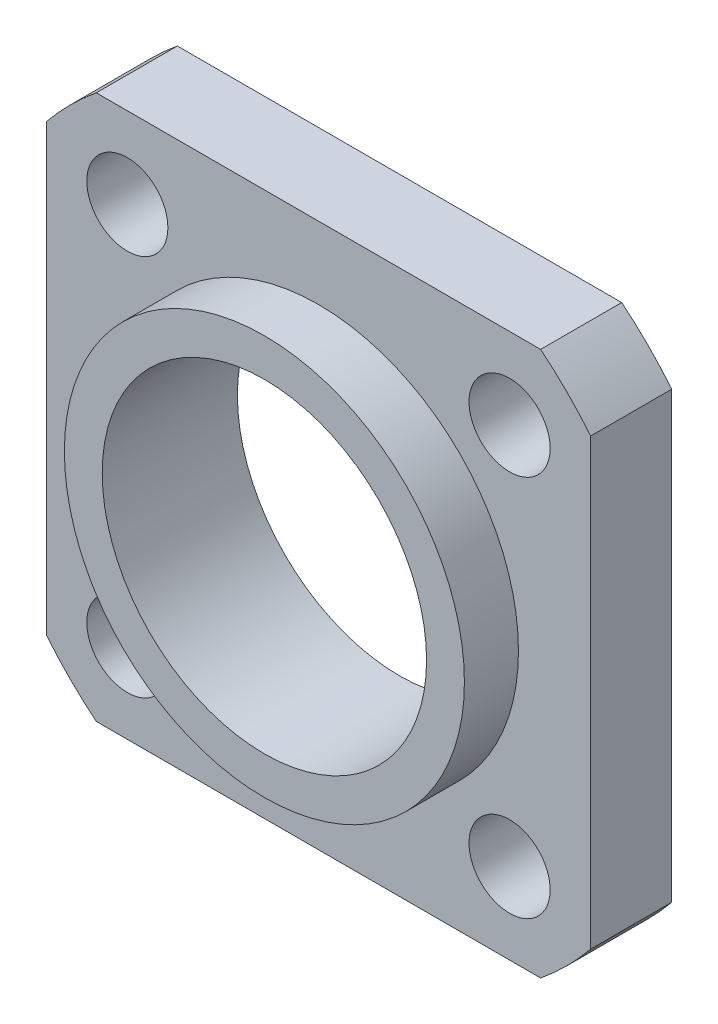
ISO-10303-21;
HEADER;
FILE_DESCRIPTION(('STEP AP214'),'2;1');
FILE_NAME('part.step','',(''),(''),'','','');
FILE_SCHEMA(('AUTOMOTIVE_DESIGN { 1 0 10303 214 1 1 1 1 }'));
ENDSEC;
DATA;
#1=APPLICATION_CONTEXT('core data for automotive mechanical design processes');
#2=APPLICATION_PROTOCOL_DEFINITION('international standard','automotive_design',2000,#1);
#3=PRODUCT_CONTEXT('',#1,'mechanical');
#4=PRODUCT('Part','Part','',(#3));
#5=PRODUCT_RELATED_PRODUCT_CATEGORY('part','',(#4));
#6=PRODUCT_DEFINITION_FORMATION('','',#4);
#7=PRODUCT_DEFINITION_CONTEXT('part definition',#1,'design');
#8=PRODUCT_DEFINITION('design','',#6,#7);
#9=PRODUCT_DEFINITION_SHAPE('','',#8);
#10=(LENGTH_UNIT() NAMED_UNIT(*) SI_UNIT(.MILLI.,.METRE.));
#11=(NAMED_UNIT(*) PLANE_ANGLE_UNIT() SI_UNIT($,.RADIAN.));
#12=(NAMED_UNIT(*) SI_UNIT($,.STERADIAN.) SOLID_ANGLE_UNIT());
#13=UNCERTAINTY_MEASURE_WITH_UNIT(LENGTH_MEASURE(1.E-05),#10,'distance_accuracy_value','');
#14=(GEOMETRIC_REPRESENTATION_CONTEXT(3) GLOBAL_UNCERTAINTY_ASSIGNED_CONTEXT((#13)) GLOBAL_UNIT_ASSIGNED_CONTEXT((#10,
#11,#12)) REPRESENTATION_CONTEXT('',''));
#15=CARTESIAN_POINT('',(0.,0.,0.));
#16=DIRECTION('',(0.,0.,1.));
#17=DIRECTION('',(1.,0.,0.));
#18=AXIS2_PLACEMENT_3D('',#15,#16,#17);
#19=CARTESIAN_POINT('',(0.,0.,3.));
#20=DIRECTION('',(0.,0.,-1.));
#21=DIRECTION('',(-1.,0.,0.));
#22=AXIS2_PLACEMENT_3D('',#19,#20,#21);
#23=CYLINDRICAL_SURFACE('',#22,13.);
#24=CARTESIAN_POINT('',(0.,0.,3.));
#25=DIRECTION('',(0.,0.,1.));
#26=DIRECTION('',(1.,0.,0.));
#27=AXIS2_PLACEMENT_3D('',#24,#25,#26);
#28=CIRCLE('',#27,13.);
#29=CARTESIAN_POINT('',(-8.22031587767818,10.0710678118654,3.));
#30=VERTEX_POINT('',#29);
#31=CARTESIAN_POINT('',(-10.0710678118654,8.22031587767818,3.));
#32=VERTEX_POINT('',#31);
#33=EDGE_CURVE('E119',#30,#32,#28,.T.);
#34=ORIENTED_EDGE('',*,*,#33,.F.);
#35=DIRECTION('',(0.,0.,-1.));
#36=VECTOR('',#35,1.);
#37=CARTESIAN_POINT('',(-8.22031587767818,10.0710678118654,3.));
#38=LINE('',#37,#36);
#39=CARTESIAN_POINT('',(-8.22031587767818,10.0710678118654,0.));
#40=VERTEX_POINT('',#39);
#41=EDGE_CURVE('E11',#30,#40,#38,.T.);
#42=ORIENTED_EDGE('',*,*,#41,.T.);
#43=CARTESIAN_POINT('',(0.,0.,0.));
#44=DIRECTION('',(0.,0.,1.));
#45=DIRECTION('',(1.,0.,0.));
#46=AXIS2_PLACEMENT_3D('',#43,#44,#45);
#47=CIRCLE('',#46,13.);
#48=CARTESIAN_POINT('',(-10.0710678118654,8.22031587767818,0.));
#49=VERTEX_POINT('',#48);
#50=EDGE_CURVE('E142',#40,#49,#47,.T.);
#51=ORIENTED_EDGE('',*,*,#50,.T.);
#52=DIRECTION('',(0.,0.,-1.));
#53=VECTOR('',#52,1.);
#54=CARTESIAN_POINT('',(-10.0710678118654,8.22031587767818,3.));
#55=LINE('',#54,#53);
#56=EDGE_CURVE('E126',#49,#32,#55,.F.);
#57=ORIENTED_EDGE('',*,*,#56,.T.);
#58=EDGE_LOOP('',(#34,#42,#51,#57));
#59=FACE_BOUND('',#58,.T.);
#60=ADVANCED_FACE('F39',(#59),#23,.T.);
#61=CARTESIAN_POINT('',(10.0710678118654,8.22031587767818,0.));
#62=VERTEX_POINT('',#61);
#63=CARTESIAN_POINT('',(8.22031587767818,10.0710678118654,0.));
#64=VERTEX_POINT('',#63);
#65=EDGE_CURVE('E138',#62,#64,#47,.T.);
#66=ORIENTED_EDGE('',*,*,#65,.T.);
#67=DIRECTION('',(0.,0.,-1.));
#68=VECTOR('',#67,1.);
#69=CARTESIAN_POINT('',(8.22031587767818,10.0710678118654,3.));
#70=LINE('',#69,#68);
#71=CARTESIAN_POINT('',(8.22031587767818,10.0710678118654,3.));
#72=VERTEX_POINT('',#71);
#73=EDGE_CURVE('E48',#64,#72,#70,.F.);
#74=ORIENTED_EDGE('',*,*,#73,.T.);
#75=CARTESIAN_POINT('',(10.0710678118654,8.22031587767818,3.));
#76=VERTEX_POINT('',#75);
#77=EDGE_CURVE('E121',#76,#72,#28,.T.);
#78=ORIENTED_EDGE('',*,*,#77,.F.);
#79=DIRECTION('',(0.,0.,-1.));
#80=VECTOR('',#79,1.);
#81=CARTESIAN_POINT('',(10.0710678118654,8.22031587767818,3.));
#82=LINE('',#81,#80);
#83=EDGE_CURVE('E160',#76,#62,#82,.T.);
#84=ORIENTED_EDGE('',*,*,#83,.T.);
#85=EDGE_LOOP('',(#66,#74,#78,#84));
#86=FACE_BOUND('',#85,.T.);
#87=ADVANCED_FACE('F165',(#86),#23,.T.);
#88=CARTESIAN_POINT('',(8.22031587767818,-10.0710678118654,0.));
#89=VERTEX_POINT('',#88);
#90=CARTESIAN_POINT('',(10.0710678118654,-8.22031587767818,0.));
#91=VERTEX_POINT('',#90);
#92=EDGE_CURVE('E143',#89,#91,#47,.T.);
#93=ORIENTED_EDGE('',*,*,#92,.T.);
#94=DIRECTION('',(0.,0.,-1.));
#95=VECTOR('',#94,1.);
#96=CARTESIAN_POINT('',(10.0710678118654,-8.22031587767818,3.));
#97=LINE('',#96,#95);
#98=CARTESIAN_POINT('',(10.0710678118654,-8.22031587767818,3.));
#99=VERTEX_POINT('',#98);
#100=EDGE_CURVE('E157',#91,#99,#97,.F.);
#101=ORIENTED_EDGE('',*,*,#100,.T.);
#102=CARTESIAN_POINT('',(8.22031587767818,-10.0710678118654,3.));
#103=VERTEX_POINT('',#102);
#104=EDGE_CURVE('E132',#103,#99,#28,.T.);
#105=ORIENTED_EDGE('',*,*,#104,.F.);
#106=DIRECTION('',(0.,0.,-1.));
#107=VECTOR('',#106,1.);
#108=CARTESIAN_POINT('',(8.22031587767818,-10.0710678118654,3.));
#109=LINE('',#108,#107);
#110=EDGE_CURVE('E153',#103,#89,#109,.T.);
#111=ORIENTED_EDGE('',*,*,#110,.T.);
#112=EDGE_LOOP('',(#93,#101,#105,#111));
#113=FACE_BOUND('',#112,.T.);
#114=ADVANCED_FACE('F245',(#113),#23,.T.);
#115=CARTESIAN_POINT('',(0.,0.,3.));
#116=DIRECTION('',(0.,0.,1.));
#117=DIRECTION('',(1.,0.,0.));
#118=AXIS2_PLACEMENT_3D('',#115,#116,#117);
#119=PLANE('',#118);
#120=DIRECTION('',(1.,0.,0.));
#121=VECTOR('',#120,1.);
#122=CARTESIAN_POINT('',(-8.22031587767818,10.0710678118654,3.));
#123=LINE('',#122,#121);
#124=EDGE_CURVE('E105',#30,#72,#123,.T.);
#125=ORIENTED_EDGE('',*,*,#124,.F.);
#126=ORIENTED_EDGE('',*,*,#33,.T.);
#127=DIRECTION('',(0.,1.,0.));
#128=VECTOR('',#127,1.);
#129=CARTESIAN_POINT('',(-10.0710678118654,-8.22031587767818,3.));
#130=LINE('',#129,#128);
#131=CARTESIAN_POINT('',(-10.0710678118654,-8.22031587767818,3.));
#132=VERTEX_POINT('',#131);
#133=EDGE_CURVE('E398',#132,#32,#130,.T.);
#134=ORIENTED_EDGE('',*,*,#133,.F.);
#135=CARTESIAN_POINT('',(-8.22031587767818,-10.0710678118654,3.));
#136=VERTEX_POINT('',#135);
#137=EDGE_CURVE('E128',#132,#136,#28,.T.);
#138=ORIENTED_EDGE('',*,*,#137,.T.);
#139=DIRECTION('',(-1.,0.,0.));
#140=VECTOR('',#139,1.);
#141=CARTESIAN_POINT('',(8.22031587767818,-10.0710678118654,3.));
#142=LINE('',#141,#140);
#143=EDGE_CURVE('E63',#103,#136,#142,.T.);
#144=ORIENTED_EDGE('',*,*,#143,.F.);
#145=ORIENTED_EDGE('',*,*,#104,.T.);
#146=DIRECTION('',(0.,-1.,0.));
#147=VECTOR('',#146,1.);
#148=CARTESIAN_POINT('',(10.0710678118654,8.22031587767818,3.));
#149=LINE('',#148,#147);
#150=EDGE_CURVE('E55',#76,#99,#149,.T.);
#151=ORIENTED_EDGE('',*,*,#150,.F.);
#152=ORIENTED_EDGE('',*,*,#77,.T.);
#153=EDGE_LOOP('',(#125,#126,#134,#138,#144,#145,#151,#152));
#154=FACE_BOUND('',#153,.T.);
#155=CARTESIAN_POINT('',(-7.07106781186543,-7.07106781186552,3.));
#156=DIRECTION('',(0.,0.,1.));
#157=DIRECTION('',(1.,0.,0.));
#158=AXIS2_PLACEMENT_3D('',#155,#156,#157);
#159=CIRCLE('',#158,1.5);
#160=CARTESIAN_POINT('',(-5.57106781186543,-7.07106781186552,3.));
#161=VERTEX_POINT('',#160);
#162=EDGE_CURVE('E193',#161,#161,#159,.T.);
#163=ORIENTED_EDGE('',*,*,#162,.F.);
#164=EDGE_LOOP('',(#163));
#165=FACE_BOUND('',#164,.T.);
#166=CARTESIAN_POINT('',(7.07106781186543,7.07106781186551,3.));
#167=DIRECTION('',(0.,0.,1.));
#168=DIRECTION('',(1.,0.,0.));
#169=AXIS2_PLACEMENT_3D('',#166,#167,#168);
#170=CIRCLE('',#169,1.5);
#171=CARTESIAN_POINT('',(8.57106781186543,7.07106781186551,3.));
#172=VERTEX_POINT('',#171);
#173=EDGE_CURVE('E209',#172,#172,#170,.T.);
#174=ORIENTED_EDGE('',*,*,#173,.F.);
#175=EDGE_LOOP('',(#174));
#176=FACE_BOUND('',#175,.T.);
#177=CARTESIAN_POINT('',(-7.07106781186551,7.07106781186543,3.));
#178=DIRECTION('',(0.,0.,1.));
#179=DIRECTION('',(1.,0.,0.));
#180=AXIS2_PLACEMENT_3D('',#177,#178,#179);
#181=CIRCLE('',#180,1.5);
#182=CARTESIAN_POINT('',(-5.57106781186551,7.07106781186543,3.));
#183=VERTEX_POINT('',#182);
#184=EDGE_CURVE('E217',#183,#183,#181,.T.);
#185=ORIENTED_EDGE('',*,*,#184,.F.);
#186=EDGE_LOOP('',(#185));
#187=FACE_BOUND('',#186,.T.);
#188=CARTESIAN_POINT('',(7.07106781186552,-7.07106781186543,3.));
#189=DIRECTION('',(0.,0.,1.));
#190=DIRECTION('',(1.,0.,0.));
#191=AXIS2_PLACEMENT_3D('',#188,#189,#190);
#192=CIRCLE('',#191,1.5);
#193=CARTESIAN_POINT('',(8.57106781186551,-7.07106781186543,3.));
#194=VERTEX_POINT('',#193);
#195=EDGE_CURVE('E201',#194,#194,#192,.T.);
#196=ORIENTED_EDGE('',*,*,#195,.F.);
#197=EDGE_LOOP('',(#196));
#198=FACE_BOUND('',#197,.T.);
#199=CARTESIAN_POINT('',(0.,0.,3.));
#200=DIRECTION('',(0.,0.,1.));
#201=DIRECTION('',(1.,0.,0.));
#202=AXIS2_PLACEMENT_3D('',#199,#200,#201);
#203=CIRCLE('',#202,7.4);
#204=CARTESIAN_POINT('',(7.4,0.,3.));
#205=VERTEX_POINT('',#204);
#206=EDGE_CURVE('E179',#205,#205,#203,.T.);
#207=ORIENTED_EDGE('',*,*,#206,.F.);
#208=EDGE_LOOP('',(#207));
#209=FACE_BOUND('',#208,.T.);
#210=ADVANCED_FACE('F116',(#154,#165,#176,#187,#198,#209),#119,.T.);
#211=CARTESIAN_POINT('',(0.,0.,0.));
#212=DIRECTION('',(0.,0.,1.));
#213=DIRECTION('',(1.,0.,0.));
#214=AXIS2_PLACEMENT_3D('',#211,#212,#213);
#215=PLANE('',#214);
#216=ORIENTED_EDGE('',*,*,#50,.F.);
#217=DIRECTION('',(1.,0.,0.));
#218=VECTOR('',#217,1.);
#219=CARTESIAN_POINT('',(0.,10.0710678118654,0.));
#220=LINE('',#219,#218);
#221=EDGE_CURVE('E108',#40,#64,#220,.T.);
#222=ORIENTED_EDGE('',*,*,#221,.T.);
#223=ORIENTED_EDGE('',*,*,#65,.F.);
#224=DIRECTION('',(0.,-1.,0.));
#225=VECTOR('',#224,1.);
#226=CARTESIAN_POINT('',(10.0710678118654,0.,0.));
#227=LINE('',#226,#225);
#228=EDGE_CURVE('E174',#62,#91,#227,.T.);
#229=ORIENTED_EDGE('',*,*,#228,.T.);
#230=ORIENTED_EDGE('',*,*,#92,.F.);
#231=DIRECTION('',(-1.,0.,0.));
#232=VECTOR('',#231,1.);
#233=CARTESIAN_POINT('',(0.,-10.0710678118654,0.));
#234=LINE('',#233,#232);
#235=CARTESIAN_POINT('',(-8.22031587767818,-10.0710678118654,0.));
#236=VERTEX_POINT('',#235);
#237=EDGE_CURVE('E181',#89,#236,#234,.T.);
#238=ORIENTED_EDGE('',*,*,#237,.T.);
#239=CARTESIAN_POINT('',(-10.0710678118654,-8.22031587767818,0.));
#240=VERTEX_POINT('',#239);
#241=EDGE_CURVE('E264',#240,#236,#47,.T.);
#242=ORIENTED_EDGE('',*,*,#241,.F.);
#243=DIRECTION('',(0.,1.,0.));
#244=VECTOR('',#243,1.);
#245=CARTESIAN_POINT('',(-10.0710678118654,0.,0.));
#246=LINE('',#245,#244);
#247=EDGE_CURVE('E123',#240,#49,#246,.T.);
#248=ORIENTED_EDGE('',*,*,#247,.T.);
#249=EDGE_LOOP('',(#216,#222,#223,#229,#230,#238,#242,#248));
#250=FACE_BOUND('',#249,.T.);
#251=CARTESIAN_POINT('',(0.,0.,0.));
#252=DIRECTION('',(0.,0.,1.));
#253=DIRECTION('',(1.,0.,0.));
#254=AXIS2_PLACEMENT_3D('',#251,#252,#253);
#255=CIRCLE('',#254,6.);
#256=CARTESIAN_POINT('',(6.,0.,0.));
#257=VERTEX_POINT('',#256);
#258=EDGE_CURVE('E136',#257,#257,#255,.T.);
#259=ORIENTED_EDGE('',*,*,#258,.T.);
#260=EDGE_LOOP('',(#259));
#261=FACE_BOUND('',#260,.T.);
#262=CARTESIAN_POINT('',(-7.07106781186551,7.07106781186543,0.));
#263=DIRECTION('',(0.,0.,1.));
#264=DIRECTION('',(1.,0.,0.));
#265=AXIS2_PLACEMENT_3D('',#262,#263,#264);
#266=CIRCLE('',#265,1.5);
#267=CARTESIAN_POINT('',(-5.57106781186551,7.07106781186543,0.));
#268=VERTEX_POINT('',#267);
#269=EDGE_CURVE('E213',#268,#268,#266,.T.);
#270=ORIENTED_EDGE('',*,*,#269,.T.);
#271=EDGE_LOOP('',(#270));
#272=FACE_BOUND('',#271,.T.);
#273=CARTESIAN_POINT('',(7.07106781186543,7.07106781186551,0.));
#274=DIRECTION('',(0.,0.,1.));
#275=DIRECTION('',(1.,0.,0.));
#276=AXIS2_PLACEMENT_3D('',#273,#274,#275);
#277=CIRCLE('',#276,1.5);
#278=CARTESIAN_POINT('',(8.57106781186543,7.07106781186551,0.));
#279=VERTEX_POINT('',#278);
#280=EDGE_CURVE('E205',#279,#279,#277,.T.);
#281=ORIENTED_EDGE('',*,*,#280,.T.);
#282=EDGE_LOOP('',(#281));
#283=FACE_BOUND('',#282,.T.);
#284=CARTESIAN_POINT('',(7.07106781186552,-7.07106781186543,0.));
#285=DIRECTION('',(0.,0.,1.));
#286=DIRECTION('',(1.,0.,0.));
#287=AXIS2_PLACEMENT_3D('',#284,#285,#286);
#288=CIRCLE('',#287,1.5);
#289=CARTESIAN_POINT('',(8.57106781186551,-7.07106781186543,0.));
#290=VERTEX_POINT('',#289);
#291=EDGE_CURVE('E197',#290,#290,#288,.T.);
#292=ORIENTED_EDGE('',*,*,#291,.T.);
#293=EDGE_LOOP('',(#292));
#294=FACE_BOUND('',#293,.T.);
#295=CARTESIAN_POINT('',(-7.07106781186543,-7.07106781186552,0.));
#296=DIRECTION('',(0.,0.,1.));
#297=DIRECTION('',(1.,0.,0.));
#298=AXIS2_PLACEMENT_3D('',#295,#296,#297);
#299=CIRCLE('',#298,1.5);
#300=CARTESIAN_POINT('',(-5.57106781186543,-7.07106781186552,0.));
#301=VERTEX_POINT('',#300);
#302=EDGE_CURVE('E189',#301,#301,#299,.T.);
#303=ORIENTED_EDGE('',*,*,#302,.T.);
#304=EDGE_LOOP('',(#303));
#305=FACE_BOUND('',#304,.T.);
#306=ADVANCED_FACE('F168',(#250,#261,#272,#283,#294,#305),#215,.F.);
#307=ORIENTED_EDGE('',*,*,#241,.T.);
#308=DIRECTION('',(0.,0.,-1.));
#309=VECTOR('',#308,1.);
#310=CARTESIAN_POINT('',(-8.22031587767818,-10.0710678118654,3.));
#311=LINE('',#310,#309);
#312=EDGE_CURVE('E150',#236,#136,#311,.F.);
#313=ORIENTED_EDGE('',*,*,#312,.T.);
#314=ORIENTED_EDGE('',*,*,#137,.F.);
#315=DIRECTION('',(0.,0.,-1.));
#316=VECTOR('',#315,1.);
#317=CARTESIAN_POINT('',(-10.0710678118654,-8.22031587767818,3.));
#318=LINE('',#317,#316);
#319=EDGE_CURVE('E146',#132,#240,#318,.T.);
#320=ORIENTED_EDGE('',*,*,#319,.T.);
#321=EDGE_LOOP('',(#307,#313,#314,#320));
#322=FACE_BOUND('',#321,.T.);
#323=ADVANCED_FACE('F41',(#322),#23,.T.);
#324=CARTESIAN_POINT('',(0.,0.,3.));
#325=DIRECTION('',(0.,0.,-1.));
#326=DIRECTION('',(-1.,0.,0.));
#327=AXIS2_PLACEMENT_3D('',#324,#325,#326);
#328=CYLINDRICAL_SURFACE('',#327,6.);
#329=ORIENTED_EDGE('',*,*,#258,.F.);
#330=EDGE_LOOP('',(#329));
#331=FACE_BOUND('',#330,.T.);
#332=CARTESIAN_POINT('',(0.,0.,5.));
#333=DIRECTION('',(0.,0.,1.));
#334=DIRECTION('',(1.,0.,0.));
#335=AXIS2_PLACEMENT_3D('',#332,#333,#334);
#336=CIRCLE('',#335,6.);
#337=CARTESIAN_POINT('',(6.,0.,5.));
#338=VERTEX_POINT('',#337);
#339=EDGE_CURVE('E173',#338,#338,#336,.T.);
#340=ORIENTED_EDGE('',*,*,#339,.T.);
#341=EDGE_LOOP('',(#340));
#342=FACE_BOUND('',#341,.T.);
#343=ADVANCED_FACE('F229',(#331,#342),#328,.F.);
#344=CARTESIAN_POINT('',(-7.07106781186551,7.07106781186543,3.));
#345=DIRECTION('',(0.,0.,-1.));
#346=DIRECTION('',(-1.,0.,0.));
#347=AXIS2_PLACEMENT_3D('',#344,#345,#346);
#348=CYLINDRICAL_SURFACE('',#347,1.5);
#349=ORIENTED_EDGE('',*,*,#184,.T.);
#350=EDGE_LOOP('',(#349));
#351=FACE_BOUND('',#350,.T.);
#352=ORIENTED_EDGE('',*,*,#269,.F.);
#353=EDGE_LOOP('',(#352));
#354=FACE_BOUND('',#353,.T.);
#355=ADVANCED_FACE('F226',(#351,#354),#348,.F.);
#356=CARTESIAN_POINT('',(7.07106781186543,7.07106781186551,3.));
#357=DIRECTION('',(0.,0.,-1.));
#358=DIRECTION('',(-1.,0.,0.));
#359=AXIS2_PLACEMENT_3D('',#356,#357,#358);
#360=CYLINDRICAL_SURFACE('',#359,1.5);
#361=ORIENTED_EDGE('',*,*,#173,.T.);
#362=EDGE_LOOP('',(#361));
#363=FACE_BOUND('',#362,.T.);
#364=ORIENTED_EDGE('',*,*,#280,.F.);
#365=EDGE_LOOP('',(#364));
#366=FACE_BOUND('',#365,.T.);
#367=ADVANCED_FACE('F228',(#363,#366),#360,.F.);
#368=CARTESIAN_POINT('',(7.07106781186552,-7.07106781186543,3.));
#369=DIRECTION('',(0.,0.,-1.));
#370=DIRECTION('',(-1.,0.,0.));
#371=AXIS2_PLACEMENT_3D('',#368,#369,#370);
#372=CYLINDRICAL_SURFACE('',#371,1.5);
#373=ORIENTED_EDGE('',*,*,#195,.T.);
#374=EDGE_LOOP('',(#373));
#375=FACE_BOUND('',#374,.T.);
#376=ORIENTED_EDGE('',*,*,#291,.F.);
#377=EDGE_LOOP('',(#376));
#378=FACE_BOUND('',#377,.T.);
#379=ADVANCED_FACE('F236',(#375,#378),#372,.F.);
#380=CARTESIAN_POINT('',(-7.07106781186543,-7.07106781186552,3.));
#381=DIRECTION('',(0.,0.,-1.));
#382=DIRECTION('',(-1.,0.,0.));
#383=AXIS2_PLACEMENT_3D('',#380,#381,#382);
#384=CYLINDRICAL_SURFACE('',#383,1.5);
#385=ORIENTED_EDGE('',*,*,#162,.T.);
#386=EDGE_LOOP('',(#385));
#387=FACE_BOUND('',#386,.T.);
#388=ORIENTED_EDGE('',*,*,#302,.F.);
#389=EDGE_LOOP('',(#388));
#390=FACE_BOUND('',#389,.T.);
#391=ADVANCED_FACE('F275',(#387,#390),#384,.F.);
#392=CARTESIAN_POINT('',(0.,0.,5.));
#393=DIRECTION('',(0.,0.,1.));
#394=DIRECTION('',(1.,0.,0.));
#395=AXIS2_PLACEMENT_3D('',#392,#393,#394);
#396=PLANE('',#395);
#397=CARTESIAN_POINT('',(0.,0.,5.));
#398=DIRECTION('',(0.,0.,1.));
#399=DIRECTION('',(1.,0.,0.));
#400=AXIS2_PLACEMENT_3D('',#397,#398,#399);
#401=CIRCLE('',#400,7.4);
#402=CARTESIAN_POINT('',(7.4,0.,5.));
#403=VERTEX_POINT('',#402);
#404=EDGE_CURVE('E185',#403,#403,#401,.T.);
#405=ORIENTED_EDGE('',*,*,#404,.T.);
#406=EDGE_LOOP('',(#405));
#407=FACE_BOUND('',#406,.T.);
#408=ORIENTED_EDGE('',*,*,#339,.F.);
#409=EDGE_LOOP('',(#408));
#410=FACE_BOUND('',#409,.T.);
#411=ADVANCED_FACE('F272',(#407,#410),#396,.T.);
#412=CARTESIAN_POINT('',(0.,0.,5.));
#413=DIRECTION('',(0.,0.,-1.));
#414=DIRECTION('',(-1.,0.,0.));
#415=AXIS2_PLACEMENT_3D('',#412,#413,#414);
#416=CYLINDRICAL_SURFACE('',#415,7.4);
#417=ORIENTED_EDGE('',*,*,#404,.F.);
#418=EDGE_LOOP('',(#417));
#419=FACE_BOUND('',#418,.T.);
#420=ORIENTED_EDGE('',*,*,#206,.T.);
#421=EDGE_LOOP('',(#420));
#422=FACE_BOUND('',#421,.T.);
#423=ADVANCED_FACE('F274',(#419,#422),#416,.T.);
#424=CARTESIAN_POINT('',(-10.0710678118654,-8.22031587767818,-38.));
#425=DIRECTION('',(1.,0.,0.));
#426=DIRECTION('',(0.,1.,0.));
#427=AXIS2_PLACEMENT_3D('',#424,#425,#426);
#428=PLANE('',#427);
#429=ORIENTED_EDGE('',*,*,#319,.F.);
#430=ORIENTED_EDGE('',*,*,#133,.T.);
#431=ORIENTED_EDGE('',*,*,#56,.F.);
#432=ORIENTED_EDGE('',*,*,#247,.F.);
#433=EDGE_LOOP('',(#429,#430,#431,#432));
#434=FACE_BOUND('',#433,.T.);
#435=ADVANCED_FACE('F282',(#434),#428,.F.);
#436=CARTESIAN_POINT('',(8.22031587767818,-10.0710678118654,-38.));
#437=DIRECTION('',(0.,1.,0.));
#438=DIRECTION('',(-1.,0.,0.));
#439=AXIS2_PLACEMENT_3D('',#436,#437,#438);
#440=PLANE('',#439);
#441=ORIENTED_EDGE('',*,*,#110,.F.);
#442=ORIENTED_EDGE('',*,*,#143,.T.);
#443=ORIENTED_EDGE('',*,*,#312,.F.);
#444=ORIENTED_EDGE('',*,*,#237,.F.);
#445=EDGE_LOOP('',(#441,#442,#443,#444));
#446=FACE_BOUND('',#445,.T.);
#447=ADVANCED_FACE('F367',(#446),#440,.F.);
#448=CARTESIAN_POINT('',(10.0710678118654,8.22031587767818,-38.));
#449=DIRECTION('',(-1.,0.,0.));
#450=DIRECTION('',(0.,0.,1.));
#451=AXIS2_PLACEMENT_3D('',#448,#449,#450);
#452=PLANE('',#451);
#453=ORIENTED_EDGE('',*,*,#83,.F.);
#454=ORIENTED_EDGE('',*,*,#150,.T.);
#455=ORIENTED_EDGE('',*,*,#100,.F.);
#456=ORIENTED_EDGE('',*,*,#228,.F.);
#457=EDGE_LOOP('',(#453,#454,#455,#456));
#458=FACE_BOUND('',#457,.T.);
#459=ADVANCED_FACE('F376',(#458),#452,.F.);
#460=CARTESIAN_POINT('',(-8.22031587767818,10.0710678118654,-38.));
#461=DIRECTION('',(0.,-1.,0.));
#462=DIRECTION('',(0.,0.,-1.));
#463=AXIS2_PLACEMENT_3D('',#460,#461,#462);
#464=PLANE('',#463);
#465=ORIENTED_EDGE('',*,*,#41,.F.);
#466=ORIENTED_EDGE('',*,*,#124,.T.);
#467=ORIENTED_EDGE('',*,*,#73,.F.);
#468=ORIENTED_EDGE('',*,*,#221,.F.);
#469=EDGE_LOOP('',(#465,#466,#467,#468));
#470=FACE_BOUND('',#469,.T.);
#471=ADVANCED_FACE('F104',(#470),#464,.F.);
#472=CLOSED_SHELL('',(#60,#87,#114,#210,#306,#323,#343,#355,#367,#379,#391,#411,#423,#435,#447,
#459,#471));
#473=MANIFOLD_SOLID_BREP('B2',#472);
#474=ADVANCED_BREP_SHAPE_REPRESENTATION('',(#18,#473),#14);
#475=SHAPE_DEFINITION_REPRESENTATION(#9,#474);
ENDSEC;
END-ISO-10303-21;
